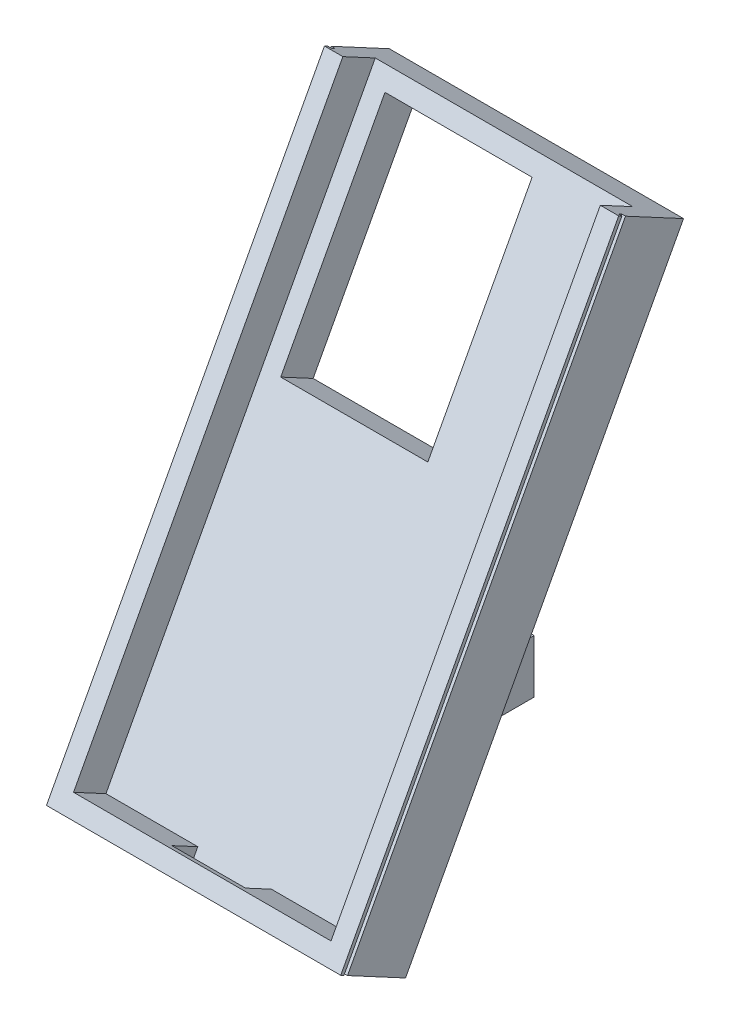
ISO-10303-21;
HEADER;
FILE_DESCRIPTION(('STEP AP214'),'2;1');
FILE_NAME('part.step','',(''),(''),'','','');
FILE_SCHEMA(('AUTOMOTIVE_DESIGN { 1 0 10303 214 1 1 1 1 }'));
ENDSEC;
DATA;
#1=APPLICATION_CONTEXT('core data for automotive mechanical design processes');
#2=APPLICATION_PROTOCOL_DEFINITION('international standard','automotive_design',2000,#1);
#3=PRODUCT_CONTEXT('',#1,'mechanical');
#4=PRODUCT('Part','Part','',(#3));
#5=PRODUCT_RELATED_PRODUCT_CATEGORY('part','',(#4));
#6=PRODUCT_DEFINITION_FORMATION('','',#4);
#7=PRODUCT_DEFINITION_CONTEXT('part definition',#1,'design');
#8=PRODUCT_DEFINITION('design','',#6,#7);
#9=PRODUCT_DEFINITION_SHAPE('','',#8);
#10=(LENGTH_UNIT() NAMED_UNIT(*) SI_UNIT(.MILLI.,.METRE.));
#11=(NAMED_UNIT(*) PLANE_ANGLE_UNIT() SI_UNIT($,.RADIAN.));
#12=(NAMED_UNIT(*) SI_UNIT($,.STERADIAN.) SOLID_ANGLE_UNIT());
#13=UNCERTAINTY_MEASURE_WITH_UNIT(LENGTH_MEASURE(1.E-05),#10,'distance_accuracy_value','');
#14=(GEOMETRIC_REPRESENTATION_CONTEXT(3) GLOBAL_UNCERTAINTY_ASSIGNED_CONTEXT((#13)) GLOBAL_UNIT_ASSIGNED_CONTEXT((#10,
#11,#12)) REPRESENTATION_CONTEXT('',''));
#15=CARTESIAN_POINT('',(0.,0.,0.));
#16=DIRECTION('',(0.,0.,1.));
#17=DIRECTION('',(1.,0.,0.));
#18=AXIS2_PLACEMENT_3D('',#15,#16,#17);
#19=CARTESIAN_POINT('',(40.,-30.9318929415671,64.0386236248852));
#20=DIRECTION('',(-1.,0.,0.));
#21=DIRECTION('',(0.,0.,1.));
#22=AXIS2_PLACEMENT_3D('',#19,#20,#21);
#23=PLANE('',#22);
#24=DIRECTION('',(0.,-0.472398321582941,-0.881385174464388));
#25=VECTOR('',#24,1.);
#26=CARTESIAN_POINT('',(40.,110.089734972735,-11.5451078283854));
#27=LINE('',#26,#25);
#28=CARTESIAN_POINT('',(40.,113.82168171324,-4.58216495011671));
#29=VERTEX_POINT('',#28);
#30=CARTESIAN_POINT('',(40.,105.365751756906,-20.3589595730293));
#31=VERTEX_POINT('',#30);
#32=EDGE_CURVE('E395',#29,#31,#27,.T.);
#33=ORIENTED_EDGE('',*,*,#32,.F.);
#34=DIRECTION('',(0.,0.881385174464388,-0.472398321582942));
#35=VECTOR('',#34,1.);
#36=CARTESIAN_POINT('',(40.,-27.1999462010618,71.001566503154));
#37=LINE('',#36,#35);
#38=CARTESIAN_POINT('',(40.,-27.1999462010618,71.001566503154));
#39=VERTEX_POINT('',#38);
#40=EDGE_CURVE('E238',#39,#29,#37,.T.);
#41=ORIENTED_EDGE('',*,*,#40,.F.);
#42=DIRECTION('',(0.,-0.472398321582941,-0.881385174464388));
#43=VECTOR('',#42,1.);
#44=CARTESIAN_POINT('',(40.,-30.9318929415671,64.0386236248852));
#45=LINE('',#44,#43);
#46=CARTESIAN_POINT('',(40.,-35.6558761573965,55.2247718802414));
#47=VERTEX_POINT('',#46);
#48=EDGE_CURVE('E372',#39,#47,#45,.T.);
#49=ORIENTED_EDGE('',*,*,#48,.T.);
#50=DIRECTION('',(0.,0.881385174464388,-0.472398321582941));
#51=VECTOR('',#50,1.);
#52=CARTESIAN_POINT('',(40.,-35.6558761573965,55.2247718802414));
#53=LINE('',#52,#51);
#54=EDGE_CURVE('E369',#47,#31,#53,.T.);
#55=ORIENTED_EDGE('',*,*,#54,.T.);
#56=EDGE_LOOP('',(#33,#41,#49,#55));
#57=FACE_BOUND('',#56,.T.);
#58=ADVANCED_FACE('F37',(#57),#23,.F.);
#59=CARTESIAN_POINT('',(-40.,-30.9318929415671,64.0386236248852));
#60=DIRECTION('',(1.,0.,0.));
#61=DIRECTION('',(0.,0.,-1.));
#62=AXIS2_PLACEMENT_3D('',#59,#60,#61);
#63=PLANE('',#62);
#64=DIRECTION('',(0.,-0.881385174464388,0.472398321582942));
#65=VECTOR('',#64,1.);
#66=CARTESIAN_POINT('',(-40.,-27.1999462010618,71.001566503154));
#67=LINE('',#66,#65);
#68=CARTESIAN_POINT('',(-40.,113.82168171324,-4.58216495011672));
#69=VERTEX_POINT('',#68);
#70=CARTESIAN_POINT('',(-40.,-27.1999462010618,71.001566503154));
#71=VERTEX_POINT('',#70);
#72=EDGE_CURVE('E258',#69,#71,#67,.T.);
#73=ORIENTED_EDGE('',*,*,#72,.F.);
#74=DIRECTION('',(0.,-0.472398321582941,-0.881385174464388));
#75=VECTOR('',#74,1.);
#76=CARTESIAN_POINT('',(-40.,110.089734972735,-11.5451078283854));
#77=LINE('',#76,#75);
#78=CARTESIAN_POINT('',(-40.,105.365751756906,-20.3589595730293));
#79=VERTEX_POINT('',#78);
#80=EDGE_CURVE('E391',#69,#79,#77,.T.);
#81=ORIENTED_EDGE('',*,*,#80,.T.);
#82=DIRECTION('',(0.,-0.881385174464388,0.472398321582941));
#83=VECTOR('',#82,1.);
#84=CARTESIAN_POINT('',(-40.,-35.6558761573965,55.2247718802414));
#85=LINE('',#84,#83);
#86=CARTESIAN_POINT('',(-40.,-35.6558761573965,55.2247718802414));
#87=VERTEX_POINT('',#86);
#88=EDGE_CURVE('E379',#79,#87,#85,.T.);
#89=ORIENTED_EDGE('',*,*,#88,.T.);
#90=DIRECTION('',(0.,-0.472398321582941,-0.881385174464388));
#91=VECTOR('',#90,1.);
#92=CARTESIAN_POINT('',(-40.,-30.9318929415671,64.0386236248852));
#93=LINE('',#92,#91);
#94=EDGE_CURVE('E387',#71,#87,#93,.T.);
#95=ORIENTED_EDGE('',*,*,#94,.F.);
#96=EDGE_LOOP('',(#73,#81,#89,#95));
#97=FACE_BOUND('',#96,.T.);
#98=ADVANCED_FACE('F490',(#97),#63,.F.);
#99=DIRECTION('',(0.,0.881385174464388,-0.472398321582942));
#100=VECTOR('',#99,1.);
#101=CARTESIAN_POINT('',(-40.,114.341319866981,-3.61264125820589));
#102=LINE('',#101,#100);
#103=CARTESIAN_POINT('',(-40.,-26.6803080473206,71.9710901950648));
#104=VERTEX_POINT('',#103);
#105=CARTESIAN_POINT('',(-40.,114.341319866981,-3.61264125820589));
#106=VERTEX_POINT('',#105);
#107=EDGE_CURVE('E256',#104,#106,#102,.T.);
#108=ORIENTED_EDGE('',*,*,#107,.F.);
#109=CARTESIAN_POINT('',(-40.,-26.2079097257377,72.8524753695292));
#110=VERTEX_POINT('',#109);
#111=EDGE_CURVE('E388',#110,#104,#93,.T.);
#112=ORIENTED_EDGE('',*,*,#111,.F.);
#113=DIRECTION('',(0.,-0.881385174464388,0.472398321582942));
#114=VECTOR('',#113,1.);
#115=CARTESIAN_POINT('',(-40.,114.813718188564,-2.73125608374151));
#116=LINE('',#115,#114);
#117=CARTESIAN_POINT('',(-40.,114.813718188564,-2.73125608374151));
#118=VERTEX_POINT('',#117);
#119=EDGE_CURVE('E340',#118,#110,#116,.T.);
#120=ORIENTED_EDGE('',*,*,#119,.F.);
#121=EDGE_CURVE('E392',#118,#106,#77,.T.);
#122=ORIENTED_EDGE('',*,*,#121,.T.);
#123=EDGE_LOOP('',(#108,#112,#120,#122));
#124=FACE_BOUND('',#123,.T.);
#125=ADVANCED_FACE('F459',(#124),#63,.F.);
#126=CARTESIAN_POINT('',(-40.,-30.9318929415671,64.0386236248852));
#127=DIRECTION('',(0.,0.881385174464388,-0.472398321582941));
#128=DIRECTION('',(0.,0.472398321582941,0.881385174464388));
#129=AXIS2_PLACEMENT_3D('',#126,#127,#128);
#130=PLANE('',#129);
#131=ORIENTED_EDGE('',*,*,#48,.F.);
#132=DIRECTION('',(1.,0.,0.));
#133=VECTOR('',#132,1.);
#134=CARTESIAN_POINT('',(39.,-27.1999462010618,71.001566503154));
#135=LINE('',#134,#133);
#136=CARTESIAN_POINT('',(39.,-27.1999462010618,71.001566503154));
#137=VERTEX_POINT('',#136);
#138=EDGE_CURVE('E245',#137,#39,#135,.T.);
#139=ORIENTED_EDGE('',*,*,#138,.F.);
#140=DIRECTION('',(0.,-0.47239832158294,-0.881385174464389));
#141=VECTOR('',#140,1.);
#142=CARTESIAN_POINT('',(39.,-26.6803080473206,71.9710901950648));
#143=LINE('',#142,#141);
#144=CARTESIAN_POINT('',(39.,-26.6803080473206,71.9710901950648));
#145=VERTEX_POINT('',#144);
#146=EDGE_CURVE('E231',#145,#137,#143,.T.);
#147=ORIENTED_EDGE('',*,*,#146,.F.);
#148=DIRECTION('',(1.,0.,0.));
#149=VECTOR('',#148,1.);
#150=CARTESIAN_POINT('',(39.,-26.6803080473206,71.9710901950648));
#151=LINE('',#150,#149);
#152=CARTESIAN_POINT('',(40.,-26.6803080473206,71.9710901950648));
#153=VERTEX_POINT('',#152);
#154=EDGE_CURVE('E229',#145,#153,#151,.T.);
#155=ORIENTED_EDGE('',*,*,#154,.T.);
#156=CARTESIAN_POINT('',(40.,-26.2079097257377,72.8524753695292));
#157=VERTEX_POINT('',#156);
#158=EDGE_CURVE('E384',#157,#153,#45,.T.);
#159=ORIENTED_EDGE('',*,*,#158,.F.);
#160=DIRECTION('',(1.,0.,0.));
#161=VECTOR('',#160,1.);
#162=CARTESIAN_POINT('',(-40.,-26.2079097257377,72.8524753695292));
#163=LINE('',#162,#161);
#164=EDGE_CURVE('E343',#110,#157,#163,.T.);
#165=ORIENTED_EDGE('',*,*,#164,.F.);
#166=ORIENTED_EDGE('',*,*,#111,.T.);
#167=DIRECTION('',(1.,0.,0.));
#168=VECTOR('',#167,1.);
#169=CARTESIAN_POINT('',(-345.266811573722,-26.6803080473206,71.9710901950648));
#170=LINE('',#169,#168);
#171=CARTESIAN_POINT('',(-39.,-26.6803080473206,71.9710901950648));
#172=VERTEX_POINT('',#171);
#173=EDGE_CURVE('E252',#104,#172,#170,.T.);
#174=ORIENTED_EDGE('',*,*,#173,.T.);
#175=DIRECTION('',(0.,-0.472398321582941,-0.881385174464388));
#176=VECTOR('',#175,1.);
#177=CARTESIAN_POINT('',(-39.,-30.9318929415671,64.0386236248852));
#178=LINE('',#177,#176);
#179=CARTESIAN_POINT('',(-39.,-27.1999462010619,71.001566503154));
#180=VERTEX_POINT('',#179);
#181=EDGE_CURVE('E260',#172,#180,#178,.T.);
#182=ORIENTED_EDGE('',*,*,#181,.T.);
#183=DIRECTION('',(1.,0.,0.));
#184=VECTOR('',#183,1.);
#185=CARTESIAN_POINT('',(-345.266811573722,-27.1999462010618,71.001566503154));
#186=LINE('',#185,#184);
#187=EDGE_CURVE('E60',#71,#180,#186,.T.);
#188=ORIENTED_EDGE('',*,*,#187,.F.);
#189=ORIENTED_EDGE('',*,*,#94,.T.);
#190=DIRECTION('',(1.,0.,0.));
#191=VECTOR('',#190,1.);
#192=CARTESIAN_POINT('',(-40.,-35.6558761573965,55.2247718802414));
#193=LINE('',#192,#191);
#194=EDGE_CURVE('E373',#87,#47,#193,.T.);
#195=ORIENTED_EDGE('',*,*,#194,.T.);
#196=EDGE_LOOP('',(#131,#139,#147,#155,#159,#165,#166,#174,#182,#188,#189,#195));
#197=FACE_BOUND('',#196,.T.);
#198=DIRECTION('',(-1.,0.,0.));
#199=VECTOR('',#198,1.);
#200=CARTESIAN_POINT('',(-10.0273045150152,-27.1527063689036,71.0897050206003));
#201=LINE('',#200,#199);
#202=CARTESIAN_POINT('',(9.97269548498479,-27.1527063689036,71.0897050206003));
#203=VERTEX_POINT('',#202);
#204=CARTESIAN_POINT('',(-10.0273045150152,-27.1527063689036,71.0897050206003));
#205=VERTEX_POINT('',#204);
#206=EDGE_CURVE('E276',#203,#205,#201,.T.);
#207=ORIENTED_EDGE('',*,*,#206,.F.);
#208=DIRECTION('',(0.,0.472398321582942,0.881385174464388));
#209=VECTOR('',#208,1.);
#210=CARTESIAN_POINT('',(9.9726954849848,-30.9318929415671,64.0386236248852));
#211=LINE('',#210,#209);
#212=CARTESIAN_POINT('',(9.9726954849848,-30.9318929415671,64.0386236248852));
#213=VERTEX_POINT('',#212);
#214=EDGE_CURVE('E271',#213,#203,#211,.T.);
#215=ORIENTED_EDGE('',*,*,#214,.F.);
#216=DIRECTION('',(1.,0.,0.));
#217=VECTOR('',#216,1.);
#218=CARTESIAN_POINT('',(-10.0273045150152,-30.9318929415671,64.0386236248852));
#219=LINE('',#218,#217);
#220=CARTESIAN_POINT('',(-10.0273045150152,-30.9318929415671,64.0386236248852));
#221=VERTEX_POINT('',#220);
#222=EDGE_CURVE('E282',#221,#213,#219,.T.);
#223=ORIENTED_EDGE('',*,*,#222,.F.);
#224=DIRECTION('',(0.,-0.472398321582942,-0.881385174464388));
#225=VECTOR('',#224,1.);
#226=CARTESIAN_POINT('',(-10.0273045150152,-30.9318929415671,64.0386236248852));
#227=LINE('',#226,#225);
#228=EDGE_CURVE('E279',#205,#221,#227,.T.);
#229=ORIENTED_EDGE('',*,*,#228,.F.);
#230=EDGE_LOOP('',(#207,#215,#223,#229));
#231=FACE_BOUND('',#230,.T.);
#232=ADVANCED_FACE('F462',(#197,#231),#130,.F.);
#233=CARTESIAN_POINT('',(0.,19.7606670360328,36.868799416402));
#234=DIRECTION('',(0.,-0.472398321582942,-0.881385174464388));
#235=DIRECTION('',(0.,0.881385174464388,-0.472398321582942));
#236=AXIS2_PLACEMENT_3D('',#233,#234,#235);
#237=PLANE('',#236);
#238=DIRECTION('',(0.,-0.881385174464388,0.472398321582942));
#239=VECTOR('',#238,1.);
#240=CARTESIAN_POINT('',(9.9726954849848,-22.1180411969232,59.3146404090558));
#241=LINE('',#240,#239);
#242=CARTESIAN_POINT('',(9.9726954849848,-26.5249670692452,61.6766320169705));
#243=VERTEX_POINT('',#242);
#244=EDGE_CURVE('E286',#243,#213,#241,.T.);
#245=ORIENTED_EDGE('',*,*,#244,.F.);
#246=DIRECTION('',(-1.,0.,0.));
#247=VECTOR('',#246,1.);
#248=CARTESIAN_POINT('',(-35.,-26.5249670692452,61.6766320169706));
#249=LINE('',#248,#247);
#250=CARTESIAN_POINT('',(35.,-26.5249670692452,61.6766320169705));
#251=VERTEX_POINT('',#250);
#252=EDGE_CURVE('E353',#251,#243,#249,.T.);
#253=ORIENTED_EDGE('',*,*,#252,.F.);
#254=DIRECTION('',(0.,-0.881385174464388,0.472398321582942));
#255=VECTOR('',#254,1.);
#256=CARTESIAN_POINT('',(35.,-26.5249670692452,61.6766320169706));
#257=LINE('',#256,#255);
#258=CARTESIAN_POINT('',(35.,110.089734972735,-11.5451078283854));
#259=VERTEX_POINT('',#258);
#260=EDGE_CURVE('E320',#259,#251,#257,.T.);
#261=ORIENTED_EDGE('',*,*,#260,.F.);
#262=DIRECTION('',(-1.,0.,0.));
#263=VECTOR('',#262,1.);
#264=CARTESIAN_POINT('',(-40.,110.089734972735,-11.5451078283854));
#265=LINE('',#264,#263);
#266=CARTESIAN_POINT('',(-35.,110.089734972735,-11.5451078283854));
#267=VERTEX_POINT('',#266);
#268=EDGE_CURVE('E370',#259,#267,#265,.T.);
#269=ORIENTED_EDGE('',*,*,#268,.T.);
#270=DIRECTION('',(0.,0.881385174464388,-0.472398321582942));
#271=VECTOR('',#270,1.);
#272=CARTESIAN_POINT('',(-35.,-26.5249670692452,61.6766320169706));
#273=LINE('',#272,#271);
#274=CARTESIAN_POINT('',(-35.,-26.5249670692452,61.6766320169705));
#275=VERTEX_POINT('',#274);
#276=EDGE_CURVE('E331',#275,#267,#273,.T.);
#277=ORIENTED_EDGE('',*,*,#276,.F.);
#278=CARTESIAN_POINT('',(-10.0273045150152,-26.5249670692452,61.6766320169705));
#279=VERTEX_POINT('',#278);
#280=EDGE_CURVE('E352',#279,#275,#249,.T.);
#281=ORIENTED_EDGE('',*,*,#280,.F.);
#282=DIRECTION('',(0.,-0.881385174464388,0.472398321582942));
#283=VECTOR('',#282,1.);
#284=CARTESIAN_POINT('',(-10.0273045150152,-22.1180411969232,59.3146404090558));
#285=LINE('',#284,#283);
#286=EDGE_CURVE('E289',#279,#221,#285,.T.);
#287=ORIENTED_EDGE('',*,*,#286,.T.);
#288=ORIENTED_EDGE('',*,*,#222,.T.);
#289=EDGE_LOOP('',(#245,#253,#261,#269,#277,#281,#287,#288));
#290=FACE_BOUND('',#289,.T.);
#291=DIRECTION('',(-1.,0.,0.));
#292=VECTOR('',#291,1.);
#293=CARTESIAN_POINT('',(-30.,105.682809100413,-9.18311622047065));
#294=LINE('',#293,#292);
#295=CARTESIAN_POINT('',(9.99999999999999,105.682809100413,-9.18311622047067));
#296=VERTEX_POINT('',#295);
#297=CARTESIAN_POINT('',(-30.,105.682809100413,-9.18311622047065));
#298=VERTEX_POINT('',#297);
#299=EDGE_CURVE('E310',#296,#298,#294,.T.);
#300=ORIENTED_EDGE('',*,*,#299,.F.);
#301=DIRECTION('',(0.,0.881385174464388,-0.472398321582941));
#302=VECTOR('',#301,1.);
#303=CARTESIAN_POINT('',(9.99999999999999,52.7996986325498,19.1607830745058));
#304=LINE('',#303,#302);
#305=CARTESIAN_POINT('',(9.99999999999999,52.7996986325498,19.1607830745058));
#306=VERTEX_POINT('',#305);
#307=EDGE_CURVE('E288',#306,#296,#304,.T.);
#308=ORIENTED_EDGE('',*,*,#307,.F.);
#309=DIRECTION('',(1.,0.,0.));
#310=VECTOR('',#309,1.);
#311=CARTESIAN_POINT('',(-30.,52.7996986325498,19.1607830745058));
#312=LINE('',#311,#310);
#313=CARTESIAN_POINT('',(-30.,52.7996986325498,19.1607830745058));
#314=VERTEX_POINT('',#313);
#315=EDGE_CURVE('E299',#314,#306,#312,.T.);
#316=ORIENTED_EDGE('',*,*,#315,.F.);
#317=DIRECTION('',(0.,-0.881385174464388,0.472398321582941));
#318=VECTOR('',#317,1.);
#319=CARTESIAN_POINT('',(-30.,52.7996986325498,19.1607830745058));
#320=LINE('',#319,#318);
#321=EDGE_CURVE('E313',#298,#314,#320,.T.);
#322=ORIENTED_EDGE('',*,*,#321,.F.);
#323=EDGE_LOOP('',(#300,#308,#316,#322));
#324=FACE_BOUND('',#323,.T.);
#325=ADVANCED_FACE('F439',(#290,#324),#237,.F.);
#326=CARTESIAN_POINT('',(19.75,-7.25,40.));
#327=DIRECTION('',(-1.,0.,0.));
#328=DIRECTION('',(0.,0.,1.));
#329=AXIS2_PLACEMENT_3D('',#326,#327,#328);
#330=PLANE('',#329);
#331=DIRECTION('',(0.,0.,-1.));
#332=VECTOR('',#331,1.);
#333=CARTESIAN_POINT('',(19.75,7.25,40.));
#334=LINE('',#333,#332);
#335=CARTESIAN_POINT('',(19.75,7.25,32.2283970034835));
#336=VERTEX_POINT('',#335);
#337=CARTESIAN_POINT('',(19.75,7.25,0.));
#338=VERTEX_POINT('',#337);
#339=EDGE_CURVE('E425',#336,#338,#334,.T.);
#340=ORIENTED_EDGE('',*,*,#339,.F.);
#341=DIRECTION('',(0.,-0.881385174464388,0.472398321582942));
#342=VECTOR('',#341,1.);
#343=CARTESIAN_POINT('',(19.75,-7.24999999999999,40.));
#344=LINE('',#343,#342);
#345=CARTESIAN_POINT('',(19.75,-7.24999999999994,40.));
#346=VERTEX_POINT('',#345);
#347=EDGE_CURVE('E401',#336,#346,#344,.T.);
#348=ORIENTED_EDGE('',*,*,#347,.T.);
#349=DIRECTION('',(0.,0.,-1.));
#350=VECTOR('',#349,1.);
#351=CARTESIAN_POINT('',(19.75,-7.25,40.));
#352=LINE('',#351,#350);
#353=CARTESIAN_POINT('',(19.75,-7.25,0.));
#354=VERTEX_POINT('',#353);
#355=EDGE_CURVE('E408',#346,#354,#352,.T.);
#356=ORIENTED_EDGE('',*,*,#355,.T.);
#357=DIRECTION('',(0.,1.,0.));
#358=VECTOR('',#357,1.);
#359=CARTESIAN_POINT('',(19.75,-7.25,0.));
#360=LINE('',#359,#358);
#361=EDGE_CURVE('E404',#354,#338,#360,.T.);
#362=ORIENTED_EDGE('',*,*,#361,.T.);
#363=EDGE_LOOP('',(#340,#348,#356,#362));
#364=FACE_BOUND('',#363,.T.);
#365=ADVANCED_FACE('F39',(#364),#330,.F.);
#366=CARTESIAN_POINT('',(-19.75,7.25,40.));
#367=DIRECTION('',(0.,-1.,0.));
#368=DIRECTION('',(0.,0.,-1.));
#369=AXIS2_PLACEMENT_3D('',#366,#367,#368);
#370=PLANE('',#369);
#371=DIRECTION('',(0.,0.,-1.));
#372=VECTOR('',#371,1.);
#373=CARTESIAN_POINT('',(-19.75,7.25,40.));
#374=LINE('',#373,#372);
#375=CARTESIAN_POINT('',(-19.75,7.25,32.2283970034835));
#376=VERTEX_POINT('',#375);
#377=CARTESIAN_POINT('',(-19.75,7.25,0.));
#378=VERTEX_POINT('',#377);
#379=EDGE_CURVE('E423',#376,#378,#374,.T.);
#380=ORIENTED_EDGE('',*,*,#379,.F.);
#381=DIRECTION('',(1.,0.,0.));
#382=VECTOR('',#381,1.);
#383=CARTESIAN_POINT('',(-19.75,7.25,32.2283970034835));
#384=LINE('',#383,#382);
#385=EDGE_CURVE('E399',#376,#336,#384,.T.);
#386=ORIENTED_EDGE('',*,*,#385,.T.);
#387=ORIENTED_EDGE('',*,*,#339,.T.);
#388=DIRECTION('',(-1.,0.,0.));
#389=VECTOR('',#388,1.);
#390=CARTESIAN_POINT('',(-19.75,7.25,0.));
#391=LINE('',#390,#389);
#392=EDGE_CURVE('E412',#338,#378,#391,.T.);
#393=ORIENTED_EDGE('',*,*,#392,.T.);
#394=EDGE_LOOP('',(#380,#386,#387,#393));
#395=FACE_BOUND('',#394,.T.);
#396=ADVANCED_FACE('F691',(#395),#370,.F.);
#397=CARTESIAN_POINT('',(-19.75,-7.25,40.));
#398=DIRECTION('',(1.,0.,0.));
#399=DIRECTION('',(0.,0.,-1.));
#400=AXIS2_PLACEMENT_3D('',#397,#398,#399);
#401=PLANE('',#400);
#402=DIRECTION('',(0.,0.,-1.));
#403=VECTOR('',#402,1.);
#404=CARTESIAN_POINT('',(-19.75,-7.25,40.));
#405=LINE('',#404,#403);
#406=CARTESIAN_POINT('',(-19.75,-7.25,40.));
#407=VERTEX_POINT('',#406);
#408=CARTESIAN_POINT('',(-19.75,-7.25,0.));
#409=VERTEX_POINT('',#408);
#410=EDGE_CURVE('E420',#407,#409,#405,.T.);
#411=ORIENTED_EDGE('',*,*,#410,.F.);
#412=DIRECTION('',(0.,0.881385174464388,-0.472398321582942));
#413=VECTOR('',#412,1.);
#414=CARTESIAN_POINT('',(-19.75,-7.24999999999999,40.));
#415=LINE('',#414,#413);
#416=EDGE_CURVE('E397',#407,#376,#415,.T.);
#417=ORIENTED_EDGE('',*,*,#416,.T.);
#418=ORIENTED_EDGE('',*,*,#379,.T.);
#419=DIRECTION('',(0.,-1.,0.));
#420=VECTOR('',#419,1.);
#421=CARTESIAN_POINT('',(-19.75,-7.25,0.));
#422=LINE('',#421,#420);
#423=EDGE_CURVE('E415',#378,#409,#422,.T.);
#424=ORIENTED_EDGE('',*,*,#423,.T.);
#425=EDGE_LOOP('',(#411,#417,#418,#424));
#426=FACE_BOUND('',#425,.T.);
#427=ADVANCED_FACE('F680',(#426),#401,.F.);
#428=CARTESIAN_POINT('',(-19.75,-7.25,40.));
#429=DIRECTION('',(0.,1.,0.));
#430=DIRECTION('',(0.,0.,1.));
#431=AXIS2_PLACEMENT_3D('',#428,#429,#430);
#432=PLANE('',#431);
#433=DIRECTION('',(1.,0.,0.));
#434=VECTOR('',#433,1.);
#435=CARTESIAN_POINT('',(-19.75,-7.25,0.));
#436=LINE('',#435,#434);
#437=EDGE_CURVE('E409',#409,#354,#436,.T.);
#438=ORIENTED_EDGE('',*,*,#437,.T.);
#439=ORIENTED_EDGE('',*,*,#355,.F.);
#440=DIRECTION('',(1.,0.,0.));
#441=VECTOR('',#440,1.);
#442=CARTESIAN_POINT('',(-19.75,-7.25,40.));
#443=LINE('',#442,#441);
#444=EDGE_CURVE('E405',#407,#346,#443,.T.);
#445=ORIENTED_EDGE('',*,*,#444,.F.);
#446=ORIENTED_EDGE('',*,*,#410,.T.);
#447=EDGE_LOOP('',(#438,#439,#445,#446));
#448=FACE_BOUND('',#447,.T.);
#449=ADVANCED_FACE('F526',(#448),#432,.F.);
#450=CARTESIAN_POINT('',(0.,0.,0.));
#451=DIRECTION('',(0.,0.,-1.));
#452=DIRECTION('',(-1.,0.,0.));
#453=AXIS2_PLACEMENT_3D('',#450,#451,#452);
#454=PLANE('',#453);
#455=ORIENTED_EDGE('',*,*,#361,.F.);
#456=ORIENTED_EDGE('',*,*,#437,.F.);
#457=ORIENTED_EDGE('',*,*,#423,.F.);
#458=ORIENTED_EDGE('',*,*,#392,.F.);
#459=EDGE_LOOP('',(#455,#456,#457,#458));
#460=FACE_BOUND('',#459,.T.);
#461=ADVANCED_FACE('F520',(#460),#454,.T.);
#462=CARTESIAN_POINT('',(0.,15.0366838202034,28.0549476717581));
#463=DIRECTION('',(0.,-0.472398321582942,-0.881385174464388));
#464=DIRECTION('',(0.,0.881385174464388,-0.472398321582942));
#465=AXIS2_PLACEMENT_3D('',#462,#463,#464);
#466=PLANE('',#465);
#467=DIRECTION('',(0.,0.881385174464388,-0.472398321582941));
#468=VECTOR('',#467,1.);
#469=CARTESIAN_POINT('',(9.99999999999999,48.0757154167204,10.3469313298619));
#470=LINE('',#469,#468);
#471=CARTESIAN_POINT('',(9.99999999999999,48.0757154167204,10.3469313298619));
#472=VERTEX_POINT('',#471);
#473=CARTESIAN_POINT('',(9.99999999999999,100.958825884584,-17.9969679651145));
#474=VERTEX_POINT('',#473);
#475=EDGE_CURVE('E295',#472,#474,#470,.T.);
#476=ORIENTED_EDGE('',*,*,#475,.T.);
#477=DIRECTION('',(-1.,0.,0.));
#478=VECTOR('',#477,1.);
#479=CARTESIAN_POINT('',(-30.,100.958825884584,-17.9969679651145));
#480=LINE('',#479,#478);
#481=CARTESIAN_POINT('',(-30.,100.958825884584,-17.9969679651146));
#482=VERTEX_POINT('',#481);
#483=EDGE_CURVE('E298',#474,#482,#480,.T.);
#484=ORIENTED_EDGE('',*,*,#483,.T.);
#485=DIRECTION('',(0.,-0.881385174464388,0.472398321582941));
#486=VECTOR('',#485,1.);
#487=CARTESIAN_POINT('',(-30.,48.0757154167204,10.3469313298619));
#488=LINE('',#487,#486);
#489=CARTESIAN_POINT('',(-30.,48.0757154167204,10.3469313298619));
#490=VERTEX_POINT('',#489);
#491=EDGE_CURVE('E302',#482,#490,#488,.T.);
#492=ORIENTED_EDGE('',*,*,#491,.T.);
#493=DIRECTION('',(1.,0.,0.));
#494=VECTOR('',#493,1.);
#495=CARTESIAN_POINT('',(-30.,48.0757154167204,10.3469313298619));
#496=LINE('',#495,#494);
#497=EDGE_CURVE('E305',#490,#472,#496,.T.);
#498=ORIENTED_EDGE('',*,*,#497,.T.);
#499=EDGE_LOOP('',(#476,#484,#492,#498));
#500=FACE_BOUND('',#499,.T.);
#501=ORIENTED_EDGE('',*,*,#54,.F.);
#502=ORIENTED_EDGE('',*,*,#194,.F.);
#503=ORIENTED_EDGE('',*,*,#88,.F.);
#504=DIRECTION('',(-1.,0.,0.));
#505=VECTOR('',#504,1.);
#506=CARTESIAN_POINT('',(-40.,105.365751756906,-20.3589595730293));
#507=LINE('',#506,#505);
#508=EDGE_CURVE('E376',#31,#79,#507,.T.);
#509=ORIENTED_EDGE('',*,*,#508,.F.);
#510=EDGE_LOOP('',(#501,#502,#503,#509));
#511=FACE_BOUND('',#510,.T.);
#512=ORIENTED_EDGE('',*,*,#347,.F.);
#513=ORIENTED_EDGE('',*,*,#385,.F.);
#514=ORIENTED_EDGE('',*,*,#416,.F.);
#515=ORIENTED_EDGE('',*,*,#444,.T.);
#516=EDGE_LOOP('',(#512,#513,#514,#515));
#517=FACE_BOUND('',#516,.T.);
#518=ADVANCED_FACE('F484',(#500,#511,#517),#466,.T.);
#519=ORIENTED_EDGE('',*,*,#158,.T.);
#520=DIRECTION('',(0.,-0.881385174464388,0.472398321582941));
#521=VECTOR('',#520,1.);
#522=CARTESIAN_POINT('',(40.,114.341319866981,-3.61264125820589));
#523=LINE('',#522,#521);
#524=CARTESIAN_POINT('',(40.,114.341319866981,-3.61264125820589));
#525=VERTEX_POINT('',#524);
#526=EDGE_CURVE('E467',#525,#153,#523,.T.);
#527=ORIENTED_EDGE('',*,*,#526,.F.);
#528=CARTESIAN_POINT('',(40.,114.813718188564,-2.73125608374151));
#529=VERTEX_POINT('',#528);
#530=EDGE_CURVE('E243',#529,#525,#27,.T.);
#531=ORIENTED_EDGE('',*,*,#530,.F.);
#532=DIRECTION('',(0.,0.881385174464388,-0.472398321582942));
#533=VECTOR('',#532,1.);
#534=CARTESIAN_POINT('',(40.,-26.2079097257377,72.8524753695292));
#535=LINE('',#534,#533);
#536=EDGE_CURVE('E346',#157,#529,#535,.T.);
#537=ORIENTED_EDGE('',*,*,#536,.F.);
#538=EDGE_LOOP('',(#519,#527,#531,#537));
#539=FACE_BOUND('',#538,.T.);
#540=ADVANCED_FACE('F466',(#539),#23,.F.);
#541=CARTESIAN_POINT('',(-40.,110.089734972735,-11.5451078283854));
#542=DIRECTION('',(0.,-0.881385174464388,0.472398321582941));
#543=DIRECTION('',(0.,-0.472398321582941,-0.881385174464388));
#544=AXIS2_PLACEMENT_3D('',#541,#542,#543);
#545=PLANE('',#544);
#546=DIRECTION('',(0.,0.472398321582939,0.881385174464389));
#547=VECTOR('',#546,1.);
#548=CARTESIAN_POINT('',(39.,113.82168171324,-4.58216495011671));
#549=LINE('',#548,#547);
#550=CARTESIAN_POINT('',(39.,113.82168171324,-4.58216495011671));
#551=VERTEX_POINT('',#550);
#552=CARTESIAN_POINT('',(39.,114.341319866981,-3.61264125820589));
#553=VERTEX_POINT('',#552);
#554=EDGE_CURVE('E232',#551,#553,#549,.T.);
#555=ORIENTED_EDGE('',*,*,#554,.F.);
#556=DIRECTION('',(1.,0.,0.));
#557=VECTOR('',#556,1.);
#558=CARTESIAN_POINT('',(39.,113.82168171324,-4.58216495011671));
#559=LINE('',#558,#557);
#560=EDGE_CURVE('E274',#551,#29,#559,.T.);
#561=ORIENTED_EDGE('',*,*,#560,.T.);
#562=ORIENTED_EDGE('',*,*,#32,.T.);
#563=ORIENTED_EDGE('',*,*,#508,.T.);
#564=ORIENTED_EDGE('',*,*,#80,.F.);
#565=DIRECTION('',(1.,0.,0.));
#566=VECTOR('',#565,1.);
#567=CARTESIAN_POINT('',(-345.266811573722,113.82168171324,-4.58216495011672));
#568=LINE('',#567,#566);
#569=CARTESIAN_POINT('',(-39.,113.82168171324,-4.58216495011671));
#570=VERTEX_POINT('',#569);
#571=EDGE_CURVE('E267',#69,#570,#568,.T.);
#572=ORIENTED_EDGE('',*,*,#571,.T.);
#573=DIRECTION('',(0.,-0.472398321582939,-0.88138517446439));
#574=VECTOR('',#573,1.);
#575=CARTESIAN_POINT('',(-39.,113.82168171324,-4.58216495011672));
#576=LINE('',#575,#574);
#577=CARTESIAN_POINT('',(-39.,114.341319866981,-3.61264125820588));
#578=VERTEX_POINT('',#577);
#579=EDGE_CURVE('E253',#578,#570,#576,.T.);
#580=ORIENTED_EDGE('',*,*,#579,.F.);
#581=DIRECTION('',(1.,0.,0.));
#582=VECTOR('',#581,1.);
#583=CARTESIAN_POINT('',(-345.266811573722,114.341319866981,-3.61264125820589));
#584=LINE('',#583,#582);
#585=EDGE_CURVE('E264',#106,#578,#584,.T.);
#586=ORIENTED_EDGE('',*,*,#585,.F.);
#587=ORIENTED_EDGE('',*,*,#121,.F.);
#588=DIRECTION('',(-1.,0.,0.));
#589=VECTOR('',#588,1.);
#590=CARTESIAN_POINT('',(-35.,114.813718188564,-2.7312560837415));
#591=LINE('',#590,#589);
#592=CARTESIAN_POINT('',(-35.,114.813718188564,-2.7312560837415));
#593=VERTEX_POINT('',#592);
#594=EDGE_CURVE('E337',#593,#118,#591,.T.);
#595=ORIENTED_EDGE('',*,*,#594,.F.);
#596=DIRECTION('',(0.,-0.472398321582942,-0.881385174464388));
#597=VECTOR('',#596,1.);
#598=CARTESIAN_POINT('',(-35.,114.813718188564,-2.7312560837415));
#599=LINE('',#598,#597);
#600=EDGE_CURVE('E349',#593,#267,#599,.T.);
#601=ORIENTED_EDGE('',*,*,#600,.T.);
#602=ORIENTED_EDGE('',*,*,#268,.F.);
#603=DIRECTION('',(0.,-0.472398321582942,-0.881385174464388));
#604=VECTOR('',#603,1.);
#605=CARTESIAN_POINT('',(35.,114.813718188564,-2.7312560837415));
#606=LINE('',#605,#604);
#607=CARTESIAN_POINT('',(35.,114.813718188564,-2.7312560837415));
#608=VERTEX_POINT('',#607);
#609=EDGE_CURVE('E366',#608,#259,#606,.T.);
#610=ORIENTED_EDGE('',*,*,#609,.F.);
#611=DIRECTION('',(-1.,0.,0.));
#612=VECTOR('',#611,1.);
#613=CARTESIAN_POINT('',(40.,114.813718188564,-2.73125608374151));
#614=LINE('',#613,#612);
#615=EDGE_CURVE('E327',#529,#608,#614,.T.);
#616=ORIENTED_EDGE('',*,*,#615,.F.);
#617=ORIENTED_EDGE('',*,*,#530,.T.);
#618=DIRECTION('',(1.,0.,0.));
#619=VECTOR('',#618,1.);
#620=CARTESIAN_POINT('',(39.,114.341319866981,-3.61264125820589));
#621=LINE('',#620,#619);
#622=EDGE_CURVE('E226',#553,#525,#621,.T.);
#623=ORIENTED_EDGE('',*,*,#622,.F.);
#624=EDGE_LOOP('',(#555,#561,#562,#563,#564,#572,#580,#586,#587,#595,#601,#602,#610,#616,#617,#623));
#625=FACE_BOUND('',#624,.T.);
#626=ADVANCED_FACE('F241',(#625),#545,.F.);
#627=CARTESIAN_POINT('',(35.,-21.8009838534158,70.4904837616144));
#628=DIRECTION('',(1.,0.,0.));
#629=DIRECTION('',(0.,0.,-1.));
#630=AXIS2_PLACEMENT_3D('',#627,#628,#629);
#631=PLANE('',#630);
#632=ORIENTED_EDGE('',*,*,#260,.T.);
#633=DIRECTION('',(0.,-0.472398321582942,-0.881385174464388));
#634=VECTOR('',#633,1.);
#635=CARTESIAN_POINT('',(35.,-21.8009838534158,70.4904837616144));
#636=LINE('',#635,#634);
#637=CARTESIAN_POINT('',(35.,-21.8009838534158,70.4904837616144));
#638=VERTEX_POINT('',#637);
#639=EDGE_CURVE('E363',#638,#251,#636,.T.);
#640=ORIENTED_EDGE('',*,*,#639,.F.);
#641=DIRECTION('',(0.,-0.881385174464388,0.472398321582942));
#642=VECTOR('',#641,1.);
#643=CARTESIAN_POINT('',(35.,-21.8009838534158,70.4904837616144));
#644=LINE('',#643,#642);
#645=EDGE_CURVE('E330',#608,#638,#644,.T.);
#646=ORIENTED_EDGE('',*,*,#645,.F.);
#647=ORIENTED_EDGE('',*,*,#609,.T.);
#648=EDGE_LOOP('',(#632,#640,#646,#647));
#649=FACE_BOUND('',#648,.T.);
#650=ADVANCED_FACE('F452',(#649),#631,.F.);
#651=CARTESIAN_POINT('',(-35.,-21.8009838534158,70.4904837616144));
#652=DIRECTION('',(0.,-0.881385174464388,0.472398321582942));
#653=DIRECTION('',(0.,-0.472398321582942,-0.881385174464388));
#654=AXIS2_PLACEMENT_3D('',#651,#652,#653);
#655=PLANE('',#654);
#656=ORIENTED_EDGE('',*,*,#252,.T.);
#657=DIRECTION('',(0.,0.472398321582942,0.881385174464388));
#658=VECTOR('',#657,1.);
#659=CARTESIAN_POINT('',(9.9726954849848,-21.8009838534158,70.4904837616144));
#660=LINE('',#659,#658);
#661=CARTESIAN_POINT('',(9.9726954849848,-22.7457804965816,68.7277134126856));
#662=VERTEX_POINT('',#661);
#663=EDGE_CURVE('E11',#243,#662,#660,.T.);
#664=ORIENTED_EDGE('',*,*,#663,.T.);
#665=DIRECTION('',(-1.,0.,0.));
#666=VECTOR('',#665,1.);
#667=CARTESIAN_POINT('',(-35.,-22.7457804965817,68.7277134126856));
#668=LINE('',#667,#666);
#669=CARTESIAN_POINT('',(-10.0273045150152,-22.7457804965817,68.7277134126856));
#670=VERTEX_POINT('',#669);
#671=EDGE_CURVE('E427',#662,#670,#668,.T.);
#672=ORIENTED_EDGE('',*,*,#671,.T.);
#673=DIRECTION('',(0.,-0.472398321582942,-0.881385174464388));
#674=VECTOR('',#673,1.);
#675=CARTESIAN_POINT('',(-10.0273045150152,-21.8009838534158,70.4904837616144));
#676=LINE('',#675,#674);
#677=EDGE_CURVE('E45',#670,#279,#676,.T.);
#678=ORIENTED_EDGE('',*,*,#677,.T.);
#679=ORIENTED_EDGE('',*,*,#280,.T.);
#680=DIRECTION('',(0.,-0.472398321582942,-0.881385174464388));
#681=VECTOR('',#680,1.);
#682=CARTESIAN_POINT('',(-35.,-21.8009838534158,70.4904837616144));
#683=LINE('',#682,#681);
#684=CARTESIAN_POINT('',(-35.,-21.8009838534158,70.4904837616144));
#685=VERTEX_POINT('',#684);
#686=EDGE_CURVE('E360',#685,#275,#683,.T.);
#687=ORIENTED_EDGE('',*,*,#686,.F.);
#688=DIRECTION('',(-1.,0.,0.));
#689=VECTOR('',#688,1.);
#690=CARTESIAN_POINT('',(-35.,-21.8009838534158,70.4904837616144));
#691=LINE('',#690,#689);
#692=EDGE_CURVE('E333',#638,#685,#691,.T.);
#693=ORIENTED_EDGE('',*,*,#692,.F.);
#694=ORIENTED_EDGE('',*,*,#639,.T.);
#695=EDGE_LOOP('',(#656,#664,#672,#678,#679,#687,#693,#694));
#696=FACE_BOUND('',#695,.T.);
#697=ADVANCED_FACE('F433',(#696),#655,.F.);
#698=CARTESIAN_POINT('',(-35.,-21.8009838534158,70.4904837616144));
#699=DIRECTION('',(-1.,0.,0.));
#700=DIRECTION('',(0.,0.,1.));
#701=AXIS2_PLACEMENT_3D('',#698,#699,#700);
#702=PLANE('',#701);
#703=ORIENTED_EDGE('',*,*,#276,.T.);
#704=ORIENTED_EDGE('',*,*,#600,.F.);
#705=DIRECTION('',(0.,0.881385174464388,-0.472398321582942));
#706=VECTOR('',#705,1.);
#707=CARTESIAN_POINT('',(-35.,-21.8009838534158,70.4904837616144));
#708=LINE('',#707,#706);
#709=EDGE_CURVE('E335',#685,#593,#708,.T.);
#710=ORIENTED_EDGE('',*,*,#709,.F.);
#711=ORIENTED_EDGE('',*,*,#686,.T.);
#712=EDGE_LOOP('',(#703,#704,#710,#711));
#713=FACE_BOUND('',#712,.T.);
#714=ADVANCED_FACE('F445',(#713),#702,.F.);
#715=CARTESIAN_POINT('',(0.,24.4846502518622,45.6826511610459));
#716=DIRECTION('',(0.,-0.472398321582942,-0.881385174464388));
#717=DIRECTION('',(0.,0.881385174464388,-0.472398321582942));
#718=AXIS2_PLACEMENT_3D('',#715,#716,#717);
#719=PLANE('',#718);
#720=ORIENTED_EDGE('',*,*,#615,.T.);
#721=ORIENTED_EDGE('',*,*,#645,.T.);
#722=ORIENTED_EDGE('',*,*,#692,.T.);
#723=ORIENTED_EDGE('',*,*,#709,.T.);
#724=ORIENTED_EDGE('',*,*,#594,.T.);
#725=ORIENTED_EDGE('',*,*,#119,.T.);
#726=ORIENTED_EDGE('',*,*,#164,.T.);
#727=ORIENTED_EDGE('',*,*,#536,.T.);
#728=EDGE_LOOP('',(#720,#721,#722,#723,#724,#725,#726,#727));
#729=FACE_BOUND('',#728,.T.);
#730=ADVANCED_FACE('F449',(#729),#719,.F.);
#731=CARTESIAN_POINT('',(9.99999999999999,48.0757154167204,10.3469313298619));
#732=DIRECTION('',(1.,0.,0.));
#733=DIRECTION('',(0.,0.,-1.));
#734=AXIS2_PLACEMENT_3D('',#731,#732,#733);
#735=PLANE('',#734);
#736=ORIENTED_EDGE('',*,*,#307,.T.);
#737=DIRECTION('',(0.,0.472398321582941,0.881385174464388));
#738=VECTOR('',#737,1.);
#739=CARTESIAN_POINT('',(9.99999999999999,100.958825884584,-17.9969679651145));
#740=LINE('',#739,#738);
#741=EDGE_CURVE('E308',#474,#296,#740,.T.);
#742=ORIENTED_EDGE('',*,*,#741,.F.);
#743=ORIENTED_EDGE('',*,*,#475,.F.);
#744=DIRECTION('',(0.,0.472398321582941,0.881385174464388));
#745=VECTOR('',#744,1.);
#746=CARTESIAN_POINT('',(9.99999999999999,48.0757154167204,10.3469313298619));
#747=LINE('',#746,#745);
#748=EDGE_CURVE('E318',#472,#306,#747,.T.);
#749=ORIENTED_EDGE('',*,*,#748,.T.);
#750=EDGE_LOOP('',(#736,#742,#743,#749));
#751=FACE_BOUND('',#750,.T.);
#752=ADVANCED_FACE('F629',(#751),#735,.F.);
#753=CARTESIAN_POINT('',(-30.,48.0757154167204,10.3469313298619));
#754=DIRECTION('',(0.,-0.881385174464388,0.472398321582941));
#755=DIRECTION('',(0.,-0.472398321582941,-0.881385174464388));
#756=AXIS2_PLACEMENT_3D('',#753,#754,#755);
#757=PLANE('',#756);
#758=ORIENTED_EDGE('',*,*,#315,.T.);
#759=ORIENTED_EDGE('',*,*,#748,.F.);
#760=ORIENTED_EDGE('',*,*,#497,.F.);
#761=DIRECTION('',(0.,0.472398321582941,0.881385174464388));
#762=VECTOR('',#761,1.);
#763=CARTESIAN_POINT('',(-30.,48.0757154167204,10.3469313298619));
#764=LINE('',#763,#762);
#765=EDGE_CURVE('E321',#490,#314,#764,.T.);
#766=ORIENTED_EDGE('',*,*,#765,.T.);
#767=EDGE_LOOP('',(#758,#759,#760,#766));
#768=FACE_BOUND('',#767,.T.);
#769=ADVANCED_FACE('F618',(#768),#757,.F.);
#770=CARTESIAN_POINT('',(-30.,48.0757154167204,10.3469313298619));
#771=DIRECTION('',(-1.,0.,0.));
#772=DIRECTION('',(0.,0.,1.));
#773=AXIS2_PLACEMENT_3D('',#770,#771,#772);
#774=PLANE('',#773);
#775=ORIENTED_EDGE('',*,*,#321,.T.);
#776=ORIENTED_EDGE('',*,*,#765,.F.);
#777=ORIENTED_EDGE('',*,*,#491,.F.);
#778=DIRECTION('',(0.,0.472398321582941,0.881385174464388));
#779=VECTOR('',#778,1.);
#780=CARTESIAN_POINT('',(-30.,100.958825884584,-17.9969679651145));
#781=LINE('',#780,#779);
#782=EDGE_CURVE('E323',#482,#298,#781,.T.);
#783=ORIENTED_EDGE('',*,*,#782,.T.);
#784=EDGE_LOOP('',(#775,#776,#777,#783));
#785=FACE_BOUND('',#784,.T.);
#786=ADVANCED_FACE('F607',(#785),#774,.F.);
#787=CARTESIAN_POINT('',(-30.,100.958825884584,-17.9969679651145));
#788=DIRECTION('',(0.,0.881385174464388,-0.472398321582941));
#789=DIRECTION('',(0.,0.472398321582941,0.881385174464388));
#790=AXIS2_PLACEMENT_3D('',#787,#788,#789);
#791=PLANE('',#790);
#792=ORIENTED_EDGE('',*,*,#299,.T.);
#793=ORIENTED_EDGE('',*,*,#782,.F.);
#794=ORIENTED_EDGE('',*,*,#483,.F.);
#795=ORIENTED_EDGE('',*,*,#741,.T.);
#796=EDGE_LOOP('',(#792,#793,#794,#795));
#797=FACE_BOUND('',#796,.T.);
#798=ADVANCED_FACE('F575',(#797),#791,.F.);
#799=CARTESIAN_POINT('',(9.9726954849848,-22.1180411969232,59.3146404090558));
#800=DIRECTION('',(1.,0.,0.));
#801=DIRECTION('',(0.,0.,-1.));
#802=AXIS2_PLACEMENT_3D('',#799,#800,#801);
#803=PLANE('',#802);
#804=ORIENTED_EDGE('',*,*,#244,.T.);
#805=ORIENTED_EDGE('',*,*,#214,.T.);
#806=DIRECTION('',(0.,-0.881385174464388,0.472398321582942));
#807=VECTOR('',#806,1.);
#808=CARTESIAN_POINT('',(9.9726954849848,-18.3388546242597,66.3657218047709));
#809=LINE('',#808,#807);
#810=EDGE_CURVE('E285',#662,#203,#809,.T.);
#811=ORIENTED_EDGE('',*,*,#810,.F.);
#812=ORIENTED_EDGE('',*,*,#663,.F.);
#813=EDGE_LOOP('',(#804,#805,#811,#812));
#814=FACE_BOUND('',#813,.T.);
#815=ADVANCED_FACE('F565',(#814),#803,.F.);
#816=CARTESIAN_POINT('',(-10.0273045150152,-22.1180411969232,59.3146404090558));
#817=DIRECTION('',(-1.,0.,0.));
#818=DIRECTION('',(0.,0.,1.));
#819=AXIS2_PLACEMENT_3D('',#816,#817,#818);
#820=PLANE('',#819);
#821=DIRECTION('',(0.,-0.881385174464388,0.472398321582942));
#822=VECTOR('',#821,1.);
#823=CARTESIAN_POINT('',(-10.0273045150152,-18.3388546242597,66.3657218047709));
#824=LINE('',#823,#822);
#825=EDGE_CURVE('E291',#670,#205,#824,.T.);
#826=ORIENTED_EDGE('',*,*,#825,.T.);
#827=ORIENTED_EDGE('',*,*,#228,.T.);
#828=ORIENTED_EDGE('',*,*,#286,.F.);
#829=ORIENTED_EDGE('',*,*,#677,.F.);
#830=EDGE_LOOP('',(#826,#827,#828,#829));
#831=FACE_BOUND('',#830,.T.);
#832=ADVANCED_FACE('F553',(#831),#820,.F.);
#833=CARTESIAN_POINT('',(-10.0273045150152,-18.3388546242597,66.3657218047709));
#834=DIRECTION('',(0.,0.472398321582942,0.881385174464388));
#835=DIRECTION('',(0.,-0.881385174464388,0.472398321582942));
#836=AXIS2_PLACEMENT_3D('',#833,#834,#835);
#837=PLANE('',#836);
#838=ORIENTED_EDGE('',*,*,#810,.T.);
#839=ORIENTED_EDGE('',*,*,#206,.T.);
#840=ORIENTED_EDGE('',*,*,#825,.F.);
#841=ORIENTED_EDGE('',*,*,#671,.F.);
#842=EDGE_LOOP('',(#838,#839,#840,#841));
#843=FACE_BOUND('',#842,.T.);
#844=ADVANCED_FACE('F504',(#843),#837,.F.);
#845=CARTESIAN_POINT('',(-345.266811573722,-27.1999462010618,71.001566503154));
#846=DIRECTION('',(0.,-0.472398321582942,-0.881385174464388));
#847=DIRECTION('',(0.,0.881385174464388,-0.472398321582942));
#848=AXIS2_PLACEMENT_3D('',#845,#846,#847);
#849=PLANE('',#848);
#850=ORIENTED_EDGE('',*,*,#72,.T.);
#851=ORIENTED_EDGE('',*,*,#187,.T.);
#852=DIRECTION('',(0.,-0.881385174464388,0.472398321582942));
#853=VECTOR('',#852,1.);
#854=CARTESIAN_POINT('',(-39.,-27.1999462010618,71.001566503154));
#855=LINE('',#854,#853);
#856=EDGE_CURVE('E250',#570,#180,#855,.T.);
#857=ORIENTED_EDGE('',*,*,#856,.F.);
#858=ORIENTED_EDGE('',*,*,#571,.F.);
#859=EDGE_LOOP('',(#850,#851,#857,#858));
#860=FACE_BOUND('',#859,.T.);
#861=ADVANCED_FACE('F491',(#860),#849,.F.);
#862=CARTESIAN_POINT('',(-345.266811573722,114.341319866981,-3.61264125820589));
#863=DIRECTION('',(0.,0.472398321582941,0.881385174464388));
#864=DIRECTION('',(0.,-0.881385174464388,0.472398321582942));
#865=AXIS2_PLACEMENT_3D('',#862,#863,#864);
#866=PLANE('',#865);
#867=ORIENTED_EDGE('',*,*,#107,.T.);
#868=ORIENTED_EDGE('',*,*,#585,.T.);
#869=DIRECTION('',(0.,0.881385174464388,-0.472398321582942));
#870=VECTOR('',#869,1.);
#871=CARTESIAN_POINT('',(-39.,114.341319866981,-3.61264125820589));
#872=LINE('',#871,#870);
#873=EDGE_CURVE('E254',#172,#578,#872,.T.);
#874=ORIENTED_EDGE('',*,*,#873,.F.);
#875=ORIENTED_EDGE('',*,*,#173,.F.);
#876=EDGE_LOOP('',(#867,#868,#874,#875));
#877=FACE_BOUND('',#876,.T.);
#878=ADVANCED_FACE('F496',(#877),#866,.F.);
#879=CARTESIAN_POINT('',(-39.,-30.9318929415671,64.0386236248852));
#880=DIRECTION('',(1.,0.,0.));
#881=DIRECTION('',(0.,0.,-1.));
#882=AXIS2_PLACEMENT_3D('',#879,#880,#881);
#883=PLANE('',#882);
#884=ORIENTED_EDGE('',*,*,#873,.T.);
#885=ORIENTED_EDGE('',*,*,#579,.T.);
#886=ORIENTED_EDGE('',*,*,#856,.T.);
#887=ORIENTED_EDGE('',*,*,#181,.F.);
#888=EDGE_LOOP('',(#884,#885,#886,#887));
#889=FACE_BOUND('',#888,.T.);
#890=ADVANCED_FACE('F494',(#889),#883,.F.);
#891=CARTESIAN_POINT('',(39.,-27.1999462010618,71.001566503154));
#892=DIRECTION('',(0.,-0.472398321582942,-0.881385174464388));
#893=DIRECTION('',(0.,0.881385174464388,-0.472398321582942));
#894=AXIS2_PLACEMENT_3D('',#891,#892,#893);
#895=PLANE('',#894);
#896=ORIENTED_EDGE('',*,*,#40,.T.);
#897=ORIENTED_EDGE('',*,*,#560,.F.);
#898=DIRECTION('',(0.,0.881385174464388,-0.472398321582942));
#899=VECTOR('',#898,1.);
#900=CARTESIAN_POINT('',(39.,-27.1999462010618,71.001566503154));
#901=LINE('',#900,#899);
#902=EDGE_CURVE('E52',#137,#551,#901,.T.);
#903=ORIENTED_EDGE('',*,*,#902,.F.);
#904=ORIENTED_EDGE('',*,*,#138,.T.);
#905=EDGE_LOOP('',(#896,#897,#903,#904));
#906=FACE_BOUND('',#905,.T.);
#907=ADVANCED_FACE('F475',(#906),#895,.F.);
#908=CARTESIAN_POINT('',(39.,114.341319866981,-3.61264125820589));
#909=DIRECTION('',(0.,0.472398321582941,0.881385174464388));
#910=DIRECTION('',(0.,-0.881385174464388,0.472398321582941));
#911=AXIS2_PLACEMENT_3D('',#908,#909,#910);
#912=PLANE('',#911);
#913=ORIENTED_EDGE('',*,*,#526,.T.);
#914=ORIENTED_EDGE('',*,*,#154,.F.);
#915=DIRECTION('',(0.,-0.881385174464388,0.472398321582941));
#916=VECTOR('',#915,1.);
#917=CARTESIAN_POINT('',(39.,114.341319866981,-3.61264125820589));
#918=LINE('',#917,#916);
#919=EDGE_CURVE('E223',#553,#145,#918,.T.);
#920=ORIENTED_EDGE('',*,*,#919,.F.);
#921=ORIENTED_EDGE('',*,*,#622,.T.);
#922=EDGE_LOOP('',(#913,#914,#920,#921));
#923=FACE_BOUND('',#922,.T.);
#924=ADVANCED_FACE('F224',(#923),#912,.F.);
#925=CARTESIAN_POINT('',(39.,0.,0.));
#926=DIRECTION('',(1.,0.,0.));
#927=DIRECTION('',(0.,0.,-1.));
#928=AXIS2_PLACEMENT_3D('',#925,#926,#927);
#929=PLANE('',#928);
#930=ORIENTED_EDGE('',*,*,#554,.T.);
#931=ORIENTED_EDGE('',*,*,#919,.T.);
#932=ORIENTED_EDGE('',*,*,#146,.T.);
#933=ORIENTED_EDGE('',*,*,#902,.T.);
#934=EDGE_LOOP('',(#930,#931,#932,#933));
#935=FACE_BOUND('',#934,.T.);
#936=ADVANCED_FACE('F235',(#935),#929,.T.);
#937=CLOSED_SHELL('',(#58,#98,#125,#232,#325,#365,#396,#427,#449,#461,#518,#540,#626,#650,#697,
#714,#730,#752,#769,#786,#798,#815,#832,#844,#861,#878,#890,#907,#924,#936));
#938=MANIFOLD_SOLID_BREP('B2',#937);
#939=ADVANCED_BREP_SHAPE_REPRESENTATION('',(#18,#938),#14);
#940=SHAPE_DEFINITION_REPRESENTATION(#9,#939);
ENDSEC;
END-ISO-10303-21;
